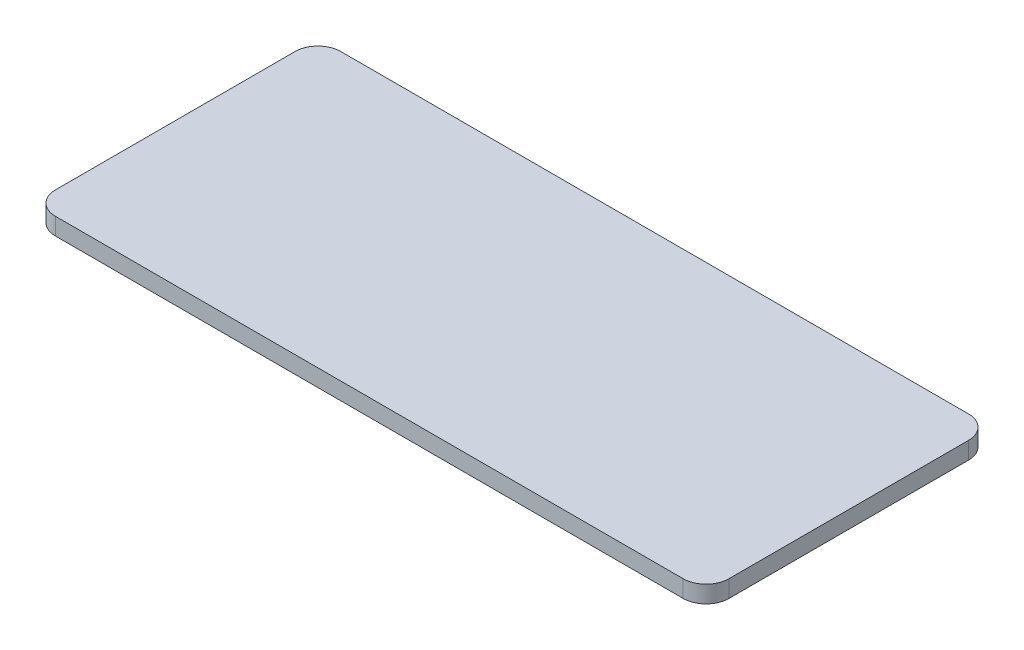
ISO-10303-21;
HEADER;
FILE_DESCRIPTION(('STEP AP214'),'2;1');
FILE_NAME('part.step','',(''),(''),'','','');
FILE_SCHEMA(('AUTOMOTIVE_DESIGN { 1 0 10303 214 1 1 1 1 }'));
ENDSEC;
DATA;
#1=APPLICATION_CONTEXT('core data for automotive mechanical design processes');
#2=APPLICATION_PROTOCOL_DEFINITION('international standard','automotive_design',2000,#1);
#3=PRODUCT_CONTEXT('',#1,'mechanical');
#4=PRODUCT('Part','Part','',(#3));
#5=PRODUCT_RELATED_PRODUCT_CATEGORY('part','',(#4));
#6=PRODUCT_DEFINITION_FORMATION('','',#4);
#7=PRODUCT_DEFINITION_CONTEXT('part definition',#1,'design');
#8=PRODUCT_DEFINITION('design','',#6,#7);
#9=PRODUCT_DEFINITION_SHAPE('','',#8);
#10=(LENGTH_UNIT() NAMED_UNIT(*) SI_UNIT(.MILLI.,.METRE.));
#11=(NAMED_UNIT(*) PLANE_ANGLE_UNIT() SI_UNIT($,.RADIAN.));
#12=(NAMED_UNIT(*) SI_UNIT($,.STERADIAN.) SOLID_ANGLE_UNIT());
#13=UNCERTAINTY_MEASURE_WITH_UNIT(LENGTH_MEASURE(1.E-05),#10,'distance_accuracy_value','');
#14=(GEOMETRIC_REPRESENTATION_CONTEXT(3) GLOBAL_UNCERTAINTY_ASSIGNED_CONTEXT((#13)) GLOBAL_UNIT_ASSIGNED_CONTEXT((#10,
#11,#12)) REPRESENTATION_CONTEXT('',''));
#15=CARTESIAN_POINT('',(0.,0.,0.));
#16=DIRECTION('',(0.,0.,1.));
#17=DIRECTION('',(1.,0.,0.));
#18=AXIS2_PLACEMENT_3D('',#15,#16,#17);
#19=CARTESIAN_POINT('',(385.912594327401,15.,-645.641483260025));
#20=DIRECTION('',(1.,0.,0.));
#21=DIRECTION('',(0.,0.,-1.));
#22=AXIS2_PLACEMENT_3D('',#19,#20,#21);
#23=PLANE('',#22);
#24=DIRECTION('',(0.,0.,1.));
#25=VECTOR('',#24,1.);
#26=CARTESIAN_POINT('',(385.912594327401,15.,-645.641483260025));
#27=LINE('',#26,#25);
#28=CARTESIAN_POINT('',(385.912594327401,15.,-625.641483260025));
#29=VERTEX_POINT('',#28);
#30=CARTESIAN_POINT('',(385.912594327401,15.,-415.641483260025));
#31=VERTEX_POINT('',#30);
#32=EDGE_CURVE('E143',#29,#31,#27,.T.);
#33=ORIENTED_EDGE('',*,*,#32,.F.);
#34=DIRECTION('',(0.,-1.,0.));
#35=VECTOR('',#34,1.);
#36=CARTESIAN_POINT('',(385.912594327401,15.,-625.641483260025));
#37=LINE('',#36,#35);
#38=CARTESIAN_POINT('',(385.912594327401,0.,-625.641483260025));
#39=VERTEX_POINT('',#38);
#40=EDGE_CURVE('E11',#29,#39,#37,.T.);
#41=ORIENTED_EDGE('',*,*,#40,.T.);
#42=DIRECTION('',(0.,0.,1.));
#43=VECTOR('',#42,1.);
#44=CARTESIAN_POINT('',(385.912594327401,0.,-645.641483260025));
#45=LINE('',#44,#43);
#46=CARTESIAN_POINT('',(385.912594327401,0.,-415.641483260025));
#47=VERTEX_POINT('',#46);
#48=EDGE_CURVE('E189',#39,#47,#45,.T.);
#49=ORIENTED_EDGE('',*,*,#48,.T.);
#50=DIRECTION('',(0.,-1.,0.));
#51=VECTOR('',#50,1.);
#52=CARTESIAN_POINT('',(385.912594327401,15.,-415.641483260025));
#53=LINE('',#52,#51);
#54=EDGE_CURVE('E54',#47,#31,#53,.F.);
#55=ORIENTED_EDGE('',*,*,#54,.T.);
#56=EDGE_LOOP('',(#33,#41,#49,#55));
#57=FACE_BOUND('',#56,.T.);
#58=ADVANCED_FACE('F45',(#57),#23,.F.);
#59=CARTESIAN_POINT('',(385.912594327401,15.,-395.641483260025));
#60=DIRECTION('',(0.,0.,-1.));
#61=DIRECTION('',(-1.,0.,0.));
#62=AXIS2_PLACEMENT_3D('',#59,#60,#61);
#63=PLANE('',#62);
#64=DIRECTION('',(1.,0.,0.));
#65=VECTOR('',#64,1.);
#66=CARTESIAN_POINT('',(385.912594327401,0.,-395.641483260025));
#67=LINE('',#66,#65);
#68=CARTESIAN_POINT('',(405.912594327401,0.,-395.641483260025));
#69=VERTEX_POINT('',#68);
#70=CARTESIAN_POINT('',(955.912594327401,0.,-395.641483260025));
#71=VERTEX_POINT('',#70);
#72=EDGE_CURVE('E150',#69,#71,#67,.T.);
#73=ORIENTED_EDGE('',*,*,#72,.T.);
#74=DIRECTION('',(0.,-1.,0.));
#75=VECTOR('',#74,1.);
#76=CARTESIAN_POINT('',(955.912594327401,15.,-395.641483260025));
#77=LINE('',#76,#75);
#78=CARTESIAN_POINT('',(955.912594327401,15.,-395.641483260025));
#79=VERTEX_POINT('',#78);
#80=EDGE_CURVE('E61',#71,#79,#77,.F.);
#81=ORIENTED_EDGE('',*,*,#80,.T.);
#82=DIRECTION('',(1.,0.,0.));
#83=VECTOR('',#82,1.);
#84=CARTESIAN_POINT('',(385.912594327401,15.,-395.641483260025));
#85=LINE('',#84,#83);
#86=CARTESIAN_POINT('',(405.912594327401,15.,-395.641483260025));
#87=VERTEX_POINT('',#86);
#88=EDGE_CURVE('E148',#87,#79,#85,.T.);
#89=ORIENTED_EDGE('',*,*,#88,.F.);
#90=DIRECTION('',(0.,-1.,0.));
#91=VECTOR('',#90,1.);
#92=CARTESIAN_POINT('',(405.912594327401,15.,-395.641483260025));
#93=LINE('',#92,#91);
#94=EDGE_CURVE('E178',#87,#69,#93,.T.);
#95=ORIENTED_EDGE('',*,*,#94,.T.);
#96=EDGE_LOOP('',(#73,#81,#89,#95));
#97=FACE_BOUND('',#96,.T.);
#98=ADVANCED_FACE('F196',(#97),#63,.F.);
#99=CARTESIAN_POINT('',(975.912594327401,15.,-395.641483260025));
#100=DIRECTION('',(-1.,0.,0.));
#101=DIRECTION('',(0.,0.,1.));
#102=AXIS2_PLACEMENT_3D('',#99,#100,#101);
#103=PLANE('',#102);
#104=DIRECTION('',(0.,0.,-1.));
#105=VECTOR('',#104,1.);
#106=CARTESIAN_POINT('',(975.912594327401,0.,-395.641483260025));
#107=LINE('',#106,#105);
#108=CARTESIAN_POINT('',(975.912594327401,0.,-415.641483260025));
#109=VERTEX_POINT('',#108);
#110=CARTESIAN_POINT('',(975.912594327401,0.,-625.641483260025));
#111=VERTEX_POINT('',#110);
#112=EDGE_CURVE('E144',#109,#111,#107,.T.);
#113=ORIENTED_EDGE('',*,*,#112,.T.);
#114=DIRECTION('',(0.,-1.,0.));
#115=VECTOR('',#114,1.);
#116=CARTESIAN_POINT('',(975.912594327401,15.,-625.641483260025));
#117=LINE('',#116,#115);
#118=CARTESIAN_POINT('',(975.912594327401,15.,-625.641483260025));
#119=VERTEX_POINT('',#118);
#120=EDGE_CURVE('E118',#111,#119,#117,.F.);
#121=ORIENTED_EDGE('',*,*,#120,.T.);
#122=DIRECTION('',(0.,0.,-1.));
#123=VECTOR('',#122,1.);
#124=CARTESIAN_POINT('',(975.912594327401,15.,-395.641483260025));
#125=LINE('',#124,#123);
#126=CARTESIAN_POINT('',(975.912594327401,15.,-415.641483260025));
#127=VERTEX_POINT('',#126);
#128=EDGE_CURVE('E203',#127,#119,#125,.T.);
#129=ORIENTED_EDGE('',*,*,#128,.F.);
#130=DIRECTION('',(0.,-1.,0.));
#131=VECTOR('',#130,1.);
#132=CARTESIAN_POINT('',(975.912594327401,15.,-415.641483260025));
#133=LINE('',#132,#131);
#134=EDGE_CURVE('E124',#127,#109,#133,.T.);
#135=ORIENTED_EDGE('',*,*,#134,.T.);
#136=EDGE_LOOP('',(#113,#121,#129,#135));
#137=FACE_BOUND('',#136,.T.);
#138=ADVANCED_FACE('F213',(#137),#103,.F.);
#139=CARTESIAN_POINT('',(975.912594327401,15.,-645.641483260025));
#140=DIRECTION('',(0.,0.,1.));
#141=DIRECTION('',(1.,0.,0.));
#142=AXIS2_PLACEMENT_3D('',#139,#140,#141);
#143=PLANE('',#142);
#144=DIRECTION('',(-1.,0.,0.));
#145=VECTOR('',#144,1.);
#146=CARTESIAN_POINT('',(975.912594327401,15.,-645.641483260025));
#147=LINE('',#146,#145);
#148=CARTESIAN_POINT('',(955.912594327401,15.,-645.641483260025));
#149=VERTEX_POINT('',#148);
#150=CARTESIAN_POINT('',(405.912594327401,15.,-645.641483260025));
#151=VERTEX_POINT('',#150);
#152=EDGE_CURVE('E134',#149,#151,#147,.T.);
#153=ORIENTED_EDGE('',*,*,#152,.F.);
#154=DIRECTION('',(0.,-1.,0.));
#155=VECTOR('',#154,1.);
#156=CARTESIAN_POINT('',(955.912594327401,15.,-645.641483260025));
#157=LINE('',#156,#155);
#158=CARTESIAN_POINT('',(955.912594327401,0.,-645.641483260025));
#159=VERTEX_POINT('',#158);
#160=EDGE_CURVE('E117',#149,#159,#157,.T.);
#161=ORIENTED_EDGE('',*,*,#160,.T.);
#162=DIRECTION('',(-1.,0.,0.));
#163=VECTOR('',#162,1.);
#164=CARTESIAN_POINT('',(975.912594327401,0.,-645.641483260025));
#165=LINE('',#164,#163);
#166=CARTESIAN_POINT('',(405.912594327401,0.,-645.641483260025));
#167=VERTEX_POINT('',#166);
#168=EDGE_CURVE('E131',#159,#167,#165,.T.);
#169=ORIENTED_EDGE('',*,*,#168,.T.);
#170=DIRECTION('',(0.,-1.,0.));
#171=VECTOR('',#170,1.);
#172=CARTESIAN_POINT('',(405.912594327401,15.,-645.641483260025));
#173=LINE('',#172,#171);
#174=EDGE_CURVE('E137',#167,#151,#173,.F.);
#175=ORIENTED_EDGE('',*,*,#174,.T.);
#176=EDGE_LOOP('',(#153,#161,#169,#175));
#177=FACE_BOUND('',#176,.T.);
#178=ADVANCED_FACE('F130',(#177),#143,.F.);
#179=CARTESIAN_POINT('',(0.,15.,0.));
#180=DIRECTION('',(0.,1.,0.));
#181=DIRECTION('',(0.,0.,1.));
#182=AXIS2_PLACEMENT_3D('',#179,#180,#181);
#183=PLANE('',#182);
#184=ORIENTED_EDGE('',*,*,#128,.T.);
#185=CARTESIAN_POINT('',(955.912594327401,15.,-625.641483260025));
#186=DIRECTION('',(0.,1.,0.));
#187=DIRECTION('',(0.,0.,1.));
#188=AXIS2_PLACEMENT_3D('',#185,#186,#187);
#189=CIRCLE('',#188,20.);
#190=EDGE_CURVE('E175',#119,#149,#189,.T.);
#191=ORIENTED_EDGE('',*,*,#190,.T.);
#192=ORIENTED_EDGE('',*,*,#152,.T.);
#193=CARTESIAN_POINT('',(405.912594327401,15.,-625.641483260025));
#194=DIRECTION('',(0.,1.,0.));
#195=DIRECTION('',(0.,0.,1.));
#196=AXIS2_PLACEMENT_3D('',#193,#194,#195);
#197=CIRCLE('',#196,20.);
#198=EDGE_CURVE('E169',#151,#29,#197,.T.);
#199=ORIENTED_EDGE('',*,*,#198,.T.);
#200=ORIENTED_EDGE('',*,*,#32,.T.);
#201=CARTESIAN_POINT('',(405.912594327401,15.,-415.641483260025));
#202=DIRECTION('',(0.,1.,0.));
#203=DIRECTION('',(0.,0.,1.));
#204=AXIS2_PLACEMENT_3D('',#201,#202,#203);
#205=CIRCLE('',#204,20.);
#206=EDGE_CURVE('E68',#31,#87,#205,.T.);
#207=ORIENTED_EDGE('',*,*,#206,.T.);
#208=ORIENTED_EDGE('',*,*,#88,.T.);
#209=CARTESIAN_POINT('',(955.912594327401,15.,-415.641483260025));
#210=DIRECTION('',(0.,1.,0.));
#211=DIRECTION('',(0.,0.,1.));
#212=AXIS2_PLACEMENT_3D('',#209,#210,#211);
#213=CIRCLE('',#212,20.);
#214=EDGE_CURVE('E172',#79,#127,#213,.T.);
#215=ORIENTED_EDGE('',*,*,#214,.T.);
#216=EDGE_LOOP('',(#184,#191,#192,#199,#200,#207,#208,#215));
#217=FACE_BOUND('',#216,.T.);
#218=ADVANCED_FACE('F192',(#217),#183,.T.);
#219=CARTESIAN_POINT('',(0.,0.,0.));
#220=DIRECTION('',(0.,1.,0.));
#221=DIRECTION('',(0.,0.,1.));
#222=AXIS2_PLACEMENT_3D('',#219,#220,#221);
#223=PLANE('',#222);
#224=ORIENTED_EDGE('',*,*,#168,.F.);
#225=CARTESIAN_POINT('',(955.912594327401,0.,-625.641483260025));
#226=DIRECTION('',(0.,1.,0.));
#227=DIRECTION('',(0.,0.,1.));
#228=AXIS2_PLACEMENT_3D('',#225,#226,#227);
#229=CIRCLE('',#228,20.);
#230=EDGE_CURVE('E113',#159,#111,#229,.F.);
#231=ORIENTED_EDGE('',*,*,#230,.T.);
#232=ORIENTED_EDGE('',*,*,#112,.F.);
#233=CARTESIAN_POINT('',(955.912594327401,0.,-415.641483260025));
#234=DIRECTION('',(0.,1.,0.));
#235=DIRECTION('',(0.,0.,1.));
#236=AXIS2_PLACEMENT_3D('',#233,#234,#235);
#237=CIRCLE('',#236,20.);
#238=EDGE_CURVE('E125',#109,#71,#237,.F.);
#239=ORIENTED_EDGE('',*,*,#238,.T.);
#240=ORIENTED_EDGE('',*,*,#72,.F.);
#241=CARTESIAN_POINT('',(405.912594327401,0.,-415.641483260025));
#242=DIRECTION('',(0.,1.,0.));
#243=DIRECTION('',(0.,0.,1.));
#244=AXIS2_PLACEMENT_3D('',#241,#242,#243);
#245=CIRCLE('',#244,20.);
#246=EDGE_CURVE('E136',#69,#47,#245,.F.);
#247=ORIENTED_EDGE('',*,*,#246,.T.);
#248=ORIENTED_EDGE('',*,*,#48,.F.);
#249=CARTESIAN_POINT('',(405.912594327401,0.,-625.641483260025));
#250=DIRECTION('',(0.,1.,0.));
#251=DIRECTION('',(0.,0.,1.));
#252=AXIS2_PLACEMENT_3D('',#249,#250,#251);
#253=CIRCLE('',#252,20.);
#254=EDGE_CURVE('E141',#39,#167,#253,.F.);
#255=ORIENTED_EDGE('',*,*,#254,.T.);
#256=EDGE_LOOP('',(#224,#231,#232,#239,#240,#247,#248,#255));
#257=FACE_BOUND('',#256,.T.);
#258=ADVANCED_FACE('F139',(#257),#223,.F.);
#259=CARTESIAN_POINT('',(955.912594327401,15.,-625.641483260025));
#260=DIRECTION('',(0.,-1.,0.));
#261=DIRECTION('',(0.,0.,-1.));
#262=AXIS2_PLACEMENT_3D('',#259,#260,#261);
#263=CYLINDRICAL_SURFACE('',#262,20.);
#264=ORIENTED_EDGE('',*,*,#190,.F.);
#265=ORIENTED_EDGE('',*,*,#120,.F.);
#266=ORIENTED_EDGE('',*,*,#230,.F.);
#267=ORIENTED_EDGE('',*,*,#160,.F.);
#268=EDGE_LOOP('',(#264,#265,#266,#267));
#269=FACE_BOUND('',#268,.T.);
#270=ADVANCED_FACE('F116',(#269),#263,.T.);
#271=CARTESIAN_POINT('',(955.912594327401,15.,-415.641483260025));
#272=DIRECTION('',(0.,-1.,0.));
#273=DIRECTION('',(0.,0.,-1.));
#274=AXIS2_PLACEMENT_3D('',#271,#272,#273);
#275=CYLINDRICAL_SURFACE('',#274,20.);
#276=ORIENTED_EDGE('',*,*,#214,.F.);
#277=ORIENTED_EDGE('',*,*,#80,.F.);
#278=ORIENTED_EDGE('',*,*,#238,.F.);
#279=ORIENTED_EDGE('',*,*,#134,.F.);
#280=EDGE_LOOP('',(#276,#277,#278,#279));
#281=FACE_BOUND('',#280,.T.);
#282=ADVANCED_FACE('F211',(#281),#275,.T.);
#283=CARTESIAN_POINT('',(405.912594327401,15.,-625.641483260025));
#284=DIRECTION('',(0.,-1.,0.));
#285=DIRECTION('',(0.,0.,-1.));
#286=AXIS2_PLACEMENT_3D('',#283,#284,#285);
#287=CYLINDRICAL_SURFACE('',#286,20.);
#288=ORIENTED_EDGE('',*,*,#198,.F.);
#289=ORIENTED_EDGE('',*,*,#174,.F.);
#290=ORIENTED_EDGE('',*,*,#254,.F.);
#291=ORIENTED_EDGE('',*,*,#40,.F.);
#292=EDGE_LOOP('',(#288,#289,#290,#291));
#293=FACE_BOUND('',#292,.T.);
#294=ADVANCED_FACE('F215',(#293),#287,.T.);
#295=CARTESIAN_POINT('',(405.912594327401,15.,-415.641483260025));
#296=DIRECTION('',(0.,-1.,0.));
#297=DIRECTION('',(0.,0.,-1.));
#298=AXIS2_PLACEMENT_3D('',#295,#296,#297);
#299=CYLINDRICAL_SURFACE('',#298,20.);
#300=ORIENTED_EDGE('',*,*,#206,.F.);
#301=ORIENTED_EDGE('',*,*,#54,.F.);
#302=ORIENTED_EDGE('',*,*,#246,.F.);
#303=ORIENTED_EDGE('',*,*,#94,.F.);
#304=EDGE_LOOP('',(#300,#301,#302,#303));
#305=FACE_BOUND('',#304,.T.);
#306=ADVANCED_FACE('F47',(#305),#299,.T.);
#307=CLOSED_SHELL('',(#58,#98,#138,#178,#218,#258,#270,#282,#294,#306));
#308=MANIFOLD_SOLID_BREP('B2',#307);
#309=ADVANCED_BREP_SHAPE_REPRESENTATION('',(#18,#308),#14);
#310=SHAPE_DEFINITION_REPRESENTATION(#9,#309);
ENDSEC;
END-ISO-10303-21;
